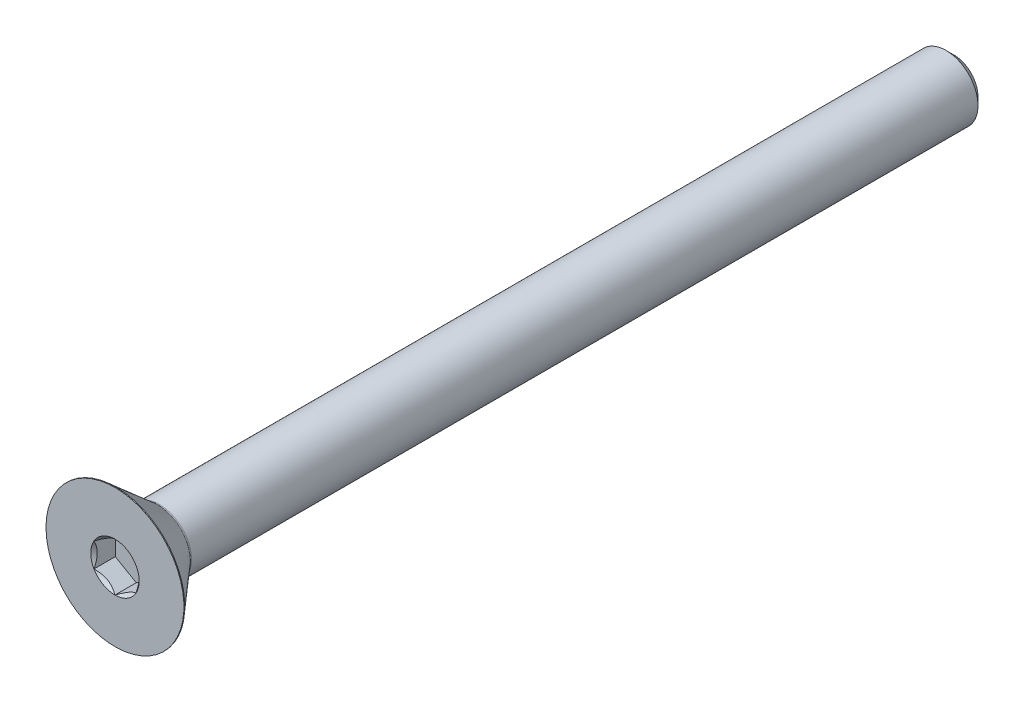
ISO-10303-21;
HEADER;
FILE_DESCRIPTION(('STEP AP214'),'2;1');
FILE_NAME('part.step','',(''),(''),'','','');
FILE_SCHEMA(('AUTOMOTIVE_DESIGN { 1 0 10303 214 1 1 1 1 }'));
ENDSEC;
DATA;
#1=APPLICATION_CONTEXT('core data for automotive mechanical design processes');
#2=APPLICATION_PROTOCOL_DEFINITION('international standard','automotive_design',2000,#1);
#3=PRODUCT_CONTEXT('',#1,'mechanical');
#4=PRODUCT('Part','Part','',(#3));
#5=PRODUCT_RELATED_PRODUCT_CATEGORY('part','',(#4));
#6=PRODUCT_DEFINITION_FORMATION('','',#4);
#7=PRODUCT_DEFINITION_CONTEXT('part definition',#1,'design');
#8=PRODUCT_DEFINITION('design','',#6,#7);
#9=PRODUCT_DEFINITION_SHAPE('','',#8);
#10=(LENGTH_UNIT() NAMED_UNIT(*) SI_UNIT(.MILLI.,.METRE.));
#11=(NAMED_UNIT(*) PLANE_ANGLE_UNIT() SI_UNIT($,.RADIAN.));
#12=(NAMED_UNIT(*) SI_UNIT($,.STERADIAN.) SOLID_ANGLE_UNIT());
#13=UNCERTAINTY_MEASURE_WITH_UNIT(LENGTH_MEASURE(1.E-05),#10,'distance_accuracy_value','');
#14=(GEOMETRIC_REPRESENTATION_CONTEXT(3) GLOBAL_UNCERTAINTY_ASSIGNED_CONTEXT((#13)) GLOBAL_UNIT_ASSIGNED_CONTEXT((#10,
#11,#12)) REPRESENTATION_CONTEXT('',''));
#15=CARTESIAN_POINT('',(0.,0.,0.));
#16=DIRECTION('',(0.,0.,1.));
#17=DIRECTION('',(1.,0.,0.));
#18=AXIS2_PLACEMENT_3D('',#15,#16,#17);
#19=CARTESIAN_POINT('',(0.,0.,31.75));
#20=DIRECTION('',(0.,0.,1.));
#21=DIRECTION('',(1.,0.,0.));
#22=AXIS2_PLACEMENT_3D('',#19,#20,#21);
#23=CONICAL_SURFACE('',#22,1.83308710467706,0.78539816339745);
#24=CARTESIAN_POINT('',(0.,0.,31.75));
#25=DIRECTION('',(0.,0.,1.));
#26=DIRECTION('',(1.,0.,0.));
#27=AXIS2_PLACEMENT_3D('',#24,#25,#26);
#28=CIRCLE('',#27,1.83308710467706);
#29=CARTESIAN_POINT('',(0.,-1.83308710467706,31.75));
#30=VERTEX_POINT('',#29);
#31=CARTESIAN_POINT('',(1.5875,-0.916543552338532,31.75));
#32=VERTEX_POINT('',#31);
#33=EDGE_CURVE('E235',#30,#32,#28,.T.);
#34=ORIENTED_EDGE('',*,*,#33,.T.);
#35=CARTESIAN_POINT('',(1.5877,-0.916428082284693,31.7501154809637));
#36=CARTESIAN_POINT('',(1.53312479190086,-0.947937093371809,31.7186308083706));
#37=CARTESIAN_POINT('',(1.47763696320971,-0.979973006203394,31.6889950460135));
#38=CARTESIAN_POINT('',(1.36449087915364,-1.04529792829092,31.6347322600208));
#39=CARTESIAN_POINT('',(1.30682185887062,-1.07859315267522,31.6101354351332));
#40=CARTESIAN_POINT('',(1.1905349781269,-1.14573141457583,31.5680003642726));
#41=CARTESIAN_POINT('',(1.13194674474407,-1.17955734689075,31.5503561927298));
#42=CARTESIAN_POINT('',(1.01348022674557,-1.24795402294714,31.523171470085));
#43=CARTESIAN_POINT('',(0.953605562983895,-1.28252267618759,31.5136106206951));
#44=CARTESIAN_POINT('',(0.850418771876558,-1.34209759781022,31.504984413104));
#45=CARTESIAN_POINT('',(0.807240015952288,-1.36702686416637,31.5037071928096));
#46=CARTESIAN_POINT('',(0.720953038535399,-1.41684467380557,31.5058570558147));
#47=CARTESIAN_POINT('',(0.677844847078612,-1.44173319974742,31.5092857885493));
#48=CARTESIAN_POINT('',(0.592046335002031,-1.49126899379091,31.5206509944333));
#49=CARTESIAN_POINT('',(0.549356408925406,-1.51591603410293,31.5285913718016));
#50=CARTESIAN_POINT('',(0.464693063478358,-1.56479643938728,31.5485484144511));
#51=CARTESIAN_POINT('',(0.422719959755075,-1.58902962212064,31.5605668292087));
#52=CARTESIAN_POINT('',(0.315211458113566,-1.65109968448354,31.5962468972473));
#53=CARTESIAN_POINT('',(0.250342771708898,-1.68855163804125,31.6225985723031));
#54=CARTESIAN_POINT('',(0.154961599380922,-1.74361998356043,31.6670835368517));
#55=CARTESIAN_POINT('',(0.123530699536156,-1.76176662204668,31.6827128578011));
#56=CARTESIAN_POINT('',(0.061246985569636,-1.79772614107138,31.7153984878611));
#57=CARTESIAN_POINT('',(0.0303939039605752,-1.8155391760437,31.732454115657));
#58=CARTESIAN_POINT('',(-0.000200000000001831,-1.8332025747309,31.7501154809637));
#59=B_SPLINE_CURVE_WITH_KNOTS('',3,(#35,#36,#37,#38,#39,#40,#41,#42,#43,#44,#45,#46,#47,#48,#49,
#50,#51,#52,#53,#54,#55,#56,#57,#58),.UNSPECIFIED.,.F.,.F.,(4,2,2,2,2,2,2,2,2,2,2,4),(0.,
0.211482650810816,0.424197870807277,0.633533884524818,0.842342653263349,0.991755553727142,
1.14122083674205,1.29081565918877,1.44047473906438,1.6781878086972,1.79671410024894,
1.91518409436631),.UNSPECIFIED.);
#60=EDGE_CURVE('E11',#32,#30,#59,.T.);
#61=ORIENTED_EDGE('',*,*,#60,.T.);
#62=EDGE_LOOP('',(#34,#61));
#63=FACE_BOUND('',#62,.T.);
#64=ADVANCED_FACE('F37',(#63),#23,.F.);
#65=CARTESIAN_POINT('',(-1.5875,-0.91654355233853,31.75));
#66=VERTEX_POINT('',#65);
#67=EDGE_CURVE('E240',#66,#30,#28,.T.);
#68=ORIENTED_EDGE('',*,*,#67,.T.);
#69=CARTESIAN_POINT('',(0.000200000000000431,-1.8332025747309,31.7501154809637));
#70=CARTESIAN_POINT('',(-0.0543752080991352,-1.80169356364378,31.7186308083706));
#71=CARTESIAN_POINT('',(-0.109863036790289,-1.7696576508122,31.6889950460135));
#72=CARTESIAN_POINT('',(-0.223009120846358,-1.70433272872468,31.6347322600208));
#73=CARTESIAN_POINT('',(-0.280678141129381,-1.67103750434037,31.6101354351332));
#74=CARTESIAN_POINT('',(-0.396965021873103,-1.60389924243976,31.5680003642726));
#75=CARTESIAN_POINT('',(-0.455553255255931,-1.57007331012484,31.5503561927298));
#76=CARTESIAN_POINT('',(-0.574019773254431,-1.50167663406845,31.523171470085));
#77=CARTESIAN_POINT('',(-0.633894437016105,-1.46710798082801,31.5136106206951));
#78=CARTESIAN_POINT('',(-0.737081228123442,-1.40753305920537,31.504984413104));
#79=CARTESIAN_POINT('',(-0.780259984047712,-1.38260379284922,31.5037071928096));
#80=CARTESIAN_POINT('',(-0.866546961464601,-1.33278598321002,31.5058570558147));
#81=CARTESIAN_POINT('',(-0.909655152921388,-1.30789745726817,31.5092857885493));
#82=CARTESIAN_POINT('',(-0.995453664997969,-1.25836166322468,31.5206509944333));
#83=CARTESIAN_POINT('',(-1.03814359107459,-1.23371462291266,31.5285913718016));
#84=CARTESIAN_POINT('',(-1.12280693652164,-1.18483421762831,31.5485484144511));
#85=CARTESIAN_POINT('',(-1.16478004024493,-1.16060103489495,31.5605668292087));
#86=CARTESIAN_POINT('',(-1.27228854188643,-1.09853097253205,31.5962468972473));
#87=CARTESIAN_POINT('',(-1.3371572282911,-1.06107901897434,31.6225985723031));
#88=CARTESIAN_POINT('',(-1.43253840061908,-1.00601067345516,31.6670835368517));
#89=CARTESIAN_POINT('',(-1.46396930046384,-0.987864034968913,31.6827128578011));
#90=CARTESIAN_POINT('',(-1.52625301443036,-0.951904515944213,31.7153984878611));
#91=CARTESIAN_POINT('',(-1.55710609603942,-0.934091480971892,31.732454115657));
#92=CARTESIAN_POINT('',(-1.5877,-0.916428082284692,31.7501154809637));
#93=B_SPLINE_CURVE_WITH_KNOTS('',3,(#69,#70,#71,#72,#73,#74,#75,#76,#77,#78,#79,#80,#81,#82,#83,
#84,#85,#86,#87,#88,#89,#90,#91,#92),.UNSPECIFIED.,.F.,.F.,(4,2,2,2,2,2,2,2,2,2,2,4),(0.,
0.211482650810816,0.424197870807277,0.633533884524818,0.842342653263349,0.991755553727142,
1.14122083674205,1.29081565918877,1.44047473906438,1.6781878086972,1.79671410024894,
1.91518409436632),.UNSPECIFIED.);
#94=EDGE_CURVE('E51',#30,#66,#93,.T.);
#95=ORIENTED_EDGE('',*,*,#94,.T.);
#96=EDGE_LOOP('',(#68,#95));
#97=FACE_BOUND('',#96,.T.);
#98=ADVANCED_FACE('F226',(#97),#23,.F.);
#99=CARTESIAN_POINT('',(-1.5875,0.916543552338532,31.75));
#100=VERTEX_POINT('',#99);
#101=EDGE_CURVE('E241',#100,#66,#28,.T.);
#102=ORIENTED_EDGE('',*,*,#101,.T.);
#103=CARTESIAN_POINT('',(-1.5875,-1.84970477544497,32.3544452553756));
#104=CARTESIAN_POINT('',(-1.5875,-1.80476240151239,32.3203462071708));
#105=CARTESIAN_POINT('',(-1.5875,-1.75957199117801,32.2865750198928));
#106=CARTESIAN_POINT('',(-1.5875,-1.66859358881314,32.2198243913548));
#107=CARTESIAN_POINT('',(-1.5875,-1.62280545181692,32.1868451478852));
#108=CARTESIAN_POINT('',(-1.5875,-1.48372199901346,32.0888287251651));
#109=CARTESIAN_POINT('',(-1.5875,-1.38939051274161,32.0252376365292));
#110=CARTESIAN_POINT('',(-1.5875,-1.1914395580246,31.9001998751445));
#111=CARTESIAN_POINT('',(-1.5875,-1.08759987522282,31.8390979424035));
#112=CARTESIAN_POINT('',(-1.5875,-0.874706489386582,31.7271896537273));
#113=CARTESIAN_POINT('',(-1.5875,-0.76567197590225,31.6763485632185));
#114=CARTESIAN_POINT('',(-1.5875,-0.602217292000081,31.6141427739001));
#115=CARTESIAN_POINT('',(-1.5875,-0.550263299202898,31.5963261951995));
#116=CARTESIAN_POINT('',(-1.5875,-0.445082037721642,31.5648615140692));
#117=CARTESIAN_POINT('',(-1.5875,-0.391854683409841,31.5512136928237));
#118=CARTESIAN_POINT('',(-1.5875,-0.285344657080772,31.5290290273729));
#119=CARTESIAN_POINT('',(-1.5875,-0.23208080021017,31.5204032745585));
#120=CARTESIAN_POINT('',(-1.5875,-0.124959456415258,31.5084346825164));
#121=CARTESIAN_POINT('',(-1.5875,-0.0711020784671781,31.5050908892227));
#122=CARTESIAN_POINT('',(-1.5875,0.0346213127870723,31.5039438271109));
#123=CARTESIAN_POINT('',(-1.5875,0.0864851538798602,31.5059346608082));
#124=CARTESIAN_POINT('',(-1.5875,0.189778917943214,31.5148876527514));
#125=CARTESIAN_POINT('',(-1.5875,0.241208798942214,31.5218502864056));
#126=CARTESIAN_POINT('',(-1.5875,0.344133383886249,31.5404812853777));
#127=CARTESIAN_POINT('',(-1.5875,0.395613227208262,31.5522304949867));
#128=CARTESIAN_POINT('',(-1.5875,0.49744523880822,31.5798036611326));
#129=CARTESIAN_POINT('',(-1.5875,0.547797493505242,31.5956273042326));
#130=CARTESIAN_POINT('',(-1.5875,0.705347074888852,31.6511176410875));
#131=CARTESIAN_POINT('',(-1.5875,0.810327219424591,31.6970631846965));
#132=CARTESIAN_POINT('',(-1.5875,1.01536433721947,31.7992446076069));
#133=CARTESIAN_POINT('',(-1.5875,1.1154020418522,31.8555172602774));
#134=CARTESIAN_POINT('',(-1.5875,1.30660224236785,31.9716420088267));
#135=CARTESIAN_POINT('',(-1.5875,1.39795887507227,32.0311784333227));
#136=CARTESIAN_POINT('',(-1.5875,1.53255412415746,32.1232282143955));
#137=CARTESIAN_POINT('',(-1.5875,1.57683885315435,32.1542385020961));
#138=CARTESIAN_POINT('',(-1.5875,1.66480239811795,32.2170825224737));
#139=CARTESIAN_POINT('',(-1.5875,1.70848137749646,32.2489160261633));
#140=CARTESIAN_POINT('',(-1.5875,1.75190803967257,32.2810909828344));
#141=B_SPLINE_CURVE_WITH_KNOTS('',3,(#103,#104,#105,#106,#107,#108,#109,#110,#111,#112,#113,
#114,#115,#116,#117,#118,#119,#120,#121,#122,#123,#124,#125,#126,#127,#128,#129,#130,#131,#132,
#133,#134,#135,#136,#137,#138,#139,#140),.UNSPECIFIED.,.F.,.F.,(4,2,2,2,2,2,2,2,2,2,2,2,2,2,2,2,
2,2,4),(0.,0.16923836493243,0.338518567064951,0.679661123808213,1.04081978780736,
1.40073457216113,1.56536778601317,1.73001210198752,1.89164527462954,2.05324924857509,
2.20870658565539,2.36417878970806,2.52239358424591,2.68059621131738,3.0233722729095,
3.36739346781147,3.69436280662922,3.85654464660761,4.0186818490024),.UNSPECIFIED.);
#142=EDGE_CURVE('E200',#66,#100,#141,.T.);
#143=ORIENTED_EDGE('',*,*,#142,.T.);
#144=EDGE_LOOP('',(#102,#143));
#145=FACE_BOUND('',#144,.T.);
#146=ADVANCED_FACE('F231',(#145),#23,.F.);
#147=CARTESIAN_POINT('',(0.,1.83308710467706,31.75));
#148=VERTEX_POINT('',#147);
#149=EDGE_CURVE('E144',#148,#100,#28,.T.);
#150=ORIENTED_EDGE('',*,*,#149,.T.);
#151=CARTESIAN_POINT('',(-1.5877,0.916428082284694,31.7501154809637));
#152=CARTESIAN_POINT('',(-1.53312479190087,0.947937093371809,31.7186308083706));
#153=CARTESIAN_POINT('',(-1.47763696320971,0.979973006203395,31.6889950460135));
#154=CARTESIAN_POINT('',(-1.36449087915364,1.04529792829092,31.6347322600208));
#155=CARTESIAN_POINT('',(-1.30682185887062,1.07859315267522,31.6101354351332));
#156=CARTESIAN_POINT('',(-1.1905349781269,1.14573141457583,31.5680003642726));
#157=CARTESIAN_POINT('',(-1.13194674474407,1.17955734689075,31.5503561927298));
#158=CARTESIAN_POINT('',(-1.01348022674557,1.24795402294714,31.523171470085));
#159=CARTESIAN_POINT('',(-0.953605562983896,1.28252267618759,31.5136106206951));
#160=CARTESIAN_POINT('',(-0.850418771876559,1.34209759781022,31.504984413104));
#161=CARTESIAN_POINT('',(-0.807240015952289,1.36702686416637,31.5037071928096));
#162=CARTESIAN_POINT('',(-0.7209530385354,1.41684467380557,31.5058570558147));
#163=CARTESIAN_POINT('',(-0.677844847078613,1.44173319974742,31.5092857885493));
#164=CARTESIAN_POINT('',(-0.592046335002032,1.49126899379091,31.5206509944333));
#165=CARTESIAN_POINT('',(-0.549356408925407,1.51591603410293,31.5285913718016));
#166=CARTESIAN_POINT('',(-0.46469306347836,1.56479643938728,31.5485484144511));
#167=CARTESIAN_POINT('',(-0.422719959755076,1.58902962212064,31.5605668292087));
#168=CARTESIAN_POINT('',(-0.315211458113566,1.65109968448354,31.5962468972473));
#169=CARTESIAN_POINT('',(-0.250342771708899,1.68855163804125,31.6225985723031));
#170=CARTESIAN_POINT('',(-0.154961599380923,1.74361998356043,31.6670835368517));
#171=CARTESIAN_POINT('',(-0.123530699536156,1.76176662204668,31.6827128578011));
#172=CARTESIAN_POINT('',(-0.0612469855696365,1.79772614107138,31.7153984878611));
#173=CARTESIAN_POINT('',(-0.0303939039605756,1.8155391760437,31.732454115657));
#174=CARTESIAN_POINT('',(0.000200000000001483,1.8332025747309,31.7501154809637));
#175=B_SPLINE_CURVE_WITH_KNOTS('',3,(#151,#152,#153,#154,#155,#156,#157,#158,#159,#160,#161,
#162,#163,#164,#165,#166,#167,#168,#169,#170,#171,#172,#173,#174),.UNSPECIFIED.,.F.,.F.,(4,2,2,
2,2,2,2,2,2,2,2,4),(0.,0.211482650810816,0.424197870807276,0.633533884524818,0.842342653263348,
0.991755553727142,1.14122083674205,1.29081565918877,1.44047473906438,1.6781878086972,
1.79671410024894,1.91518409436631),.UNSPECIFIED.);
#176=EDGE_CURVE('E108',#100,#148,#175,.T.);
#177=ORIENTED_EDGE('',*,*,#176,.T.);
#178=EDGE_LOOP('',(#150,#177));
#179=FACE_BOUND('',#178,.T.);
#180=ADVANCED_FACE('F254',(#179),#23,.F.);
#181=CARTESIAN_POINT('',(1.5875,0.916543552338531,31.75));
#182=VERTEX_POINT('',#181);
#183=EDGE_CURVE('E140',#182,#148,#28,.T.);
#184=ORIENTED_EDGE('',*,*,#183,.T.);
#185=CARTESIAN_POINT('',(-0.000200000000000509,1.8332025747309,31.7501154809637));
#186=CARTESIAN_POINT('',(0.054375208099135,1.80169356364378,31.7186308083706));
#187=CARTESIAN_POINT('',(0.109863036790288,1.7696576508122,31.6889950460135));
#188=CARTESIAN_POINT('',(0.223009120846358,1.70433272872468,31.6347322600208));
#189=CARTESIAN_POINT('',(0.280678141129381,1.67103750434037,31.6101354351332));
#190=CARTESIAN_POINT('',(0.396965021873103,1.60389924243976,31.5680003642726));
#191=CARTESIAN_POINT('',(0.455553255255931,1.57007331012484,31.5503561927298));
#192=CARTESIAN_POINT('',(0.574019773254431,1.50167663406845,31.523171470085));
#193=CARTESIAN_POINT('',(0.633894437016105,1.46710798082801,31.5136106206951));
#194=CARTESIAN_POINT('',(0.737081228123442,1.40753305920537,31.504984413104));
#195=CARTESIAN_POINT('',(0.780259984047712,1.38260379284922,31.5037071928096));
#196=CARTESIAN_POINT('',(0.866546961464601,1.33278598321002,31.5058570558147));
#197=CARTESIAN_POINT('',(0.909655152921388,1.30789745726817,31.5092857885493));
#198=CARTESIAN_POINT('',(0.995453664997969,1.25836166322469,31.5206509944333));
#199=CARTESIAN_POINT('',(1.03814359107459,1.23371462291266,31.5285913718016));
#200=CARTESIAN_POINT('',(1.12280693652164,1.18483421762831,31.5485484144511));
#201=CARTESIAN_POINT('',(1.16478004024493,1.16060103489495,31.5605668292087));
#202=CARTESIAN_POINT('',(1.27228854188643,1.09853097253205,31.5962468972473));
#203=CARTESIAN_POINT('',(1.3371572282911,1.06107901897434,31.6225985723031));
#204=CARTESIAN_POINT('',(1.43253840061908,1.00601067345516,31.6670835368517));
#205=CARTESIAN_POINT('',(1.46396930046384,0.987864034968914,31.6827128578011));
#206=CARTESIAN_POINT('',(1.52625301443036,0.951904515944214,31.7153984878611));
#207=CARTESIAN_POINT('',(1.55710609603942,0.934091480971893,31.732454115657));
#208=CARTESIAN_POINT('',(1.5877,0.916428082284692,31.7501154809637));
#209=B_SPLINE_CURVE_WITH_KNOTS('',3,(#185,#186,#187,#188,#189,#190,#191,#192,#193,#194,#195,
#196,#197,#198,#199,#200,#201,#202,#203,#204,#205,#206,#207,#208),.UNSPECIFIED.,.F.,.F.,(4,2,2,
2,2,2,2,2,2,2,2,4),(0.,0.211482650810816,0.424197870807277,0.633533884524818,0.842342653263349,
0.991755553727143,1.14122083674205,1.29081565918877,1.44047473906438,1.6781878086972,
1.79671410024894,1.91518409436631),.UNSPECIFIED.);
#210=EDGE_CURVE('E170',#148,#182,#209,.T.);
#211=ORIENTED_EDGE('',*,*,#210,.T.);
#212=EDGE_LOOP('',(#184,#211));
#213=FACE_BOUND('',#212,.T.);
#214=ADVANCED_FACE('F187',(#213),#23,.F.);
#215=CARTESIAN_POINT('',(0.,0.,-31.75));
#216=DIRECTION('',(0.,0.,-1.));
#217=DIRECTION('',(-1.,0.,0.));
#218=AXIS2_PLACEMENT_3D('',#215,#216,#217);
#219=CYLINDRICAL_SURFACE('',#218,5.2197);
#220=CARTESIAN_POINT('',(0.,0.,31.75));
#221=DIRECTION('',(0.,0.,-1.));
#222=DIRECTION('',(-1.,0.,0.));
#223=AXIS2_PLACEMENT_3D('',#220,#221,#222);
#224=CIRCLE('',#223,5.2197);
#225=CARTESIAN_POINT('',(-5.2197,0.,31.75));
#226=VERTEX_POINT('',#225);
#227=EDGE_CURVE('E159',#226,#226,#224,.T.);
#228=ORIENTED_EDGE('',*,*,#227,.T.);
#229=EDGE_LOOP('',(#228));
#230=FACE_BOUND('',#229,.T.);
#231=CARTESIAN_POINT('',(0.,0.,31.685484));
#232=DIRECTION('',(0.,0.,-1.));
#233=DIRECTION('',(-1.,0.,0.));
#234=AXIS2_PLACEMENT_3D('',#231,#232,#233);
#235=CIRCLE('',#234,5.2197);
#236=CARTESIAN_POINT('',(-5.2197,0.,31.685484));
#237=VERTEX_POINT('',#236);
#238=EDGE_CURVE('E143',#237,#237,#235,.T.);
#239=ORIENTED_EDGE('',*,*,#238,.F.);
#240=EDGE_LOOP('',(#239));
#241=FACE_BOUND('',#240,.T.);
#242=ADVANCED_FACE('F39',(#230,#241),#219,.T.);
#243=CARTESIAN_POINT('',(0.,0.,31.75));
#244=DIRECTION('',(0.,0.,1.));
#245=DIRECTION('',(1.,0.,0.));
#246=AXIS2_PLACEMENT_3D('',#243,#244,#245);
#247=PLANE('',#246);
#248=ORIENTED_EDGE('',*,*,#183,.F.);
#249=EDGE_CURVE('E133',#32,#182,#28,.T.);
#250=ORIENTED_EDGE('',*,*,#249,.F.);
#251=ORIENTED_EDGE('',*,*,#33,.F.);
#252=ORIENTED_EDGE('',*,*,#67,.F.);
#253=ORIENTED_EDGE('',*,*,#101,.F.);
#254=ORIENTED_EDGE('',*,*,#149,.F.);
#255=EDGE_LOOP('',(#248,#250,#251,#252,#253,#254));
#256=FACE_BOUND('',#255,.T.);
#257=ORIENTED_EDGE('',*,*,#227,.F.);
#258=EDGE_LOOP('',(#257));
#259=FACE_BOUND('',#258,.T.);
#260=ADVANCED_FACE('F245',(#256,#259),#247,.T.);
#261=CARTESIAN_POINT('',(0.,1.81768750000001,-31.75));
#262=DIRECTION('',(0.,0.,-1.));
#263=DIRECTION('',(-1.,0.,0.));
#264=AXIS2_PLACEMENT_3D('',#261,#262,#263);
#265=PLANE('',#264);
#266=CARTESIAN_POINT('',(0.,0.,-31.75));
#267=DIRECTION('',(0.,0.,-1.));
#268=DIRECTION('',(-1.,0.,0.));
#269=AXIS2_PLACEMENT_3D('',#266,#267,#268);
#270=CIRCLE('',#269,1.81768750000001);
#271=CARTESIAN_POINT('',(-1.81768750000001,0.,-31.75));
#272=VERTEX_POINT('',#271);
#273=EDGE_CURVE('E156',#272,#272,#270,.T.);
#274=ORIENTED_EDGE('',*,*,#273,.T.);
#275=EDGE_LOOP('',(#274));
#276=FACE_BOUND('',#275,.T.);
#277=ADVANCED_FACE('F310',(#276),#265,.T.);
#278=CARTESIAN_POINT('',(0.,0.,-31.75));
#279=DIRECTION('',(0.,0.,1.));
#280=DIRECTION('',(1.,0.,0.));
#281=AXIS2_PLACEMENT_3D('',#278,#279,#280);
#282=CONICAL_SURFACE('',#281,1.81768750000001,0.785398163397453);
#283=CARTESIAN_POINT('',(0.,0.,-31.1546875));
#284=DIRECTION('',(0.,0.,-1.));
#285=DIRECTION('',(-1.,0.,0.));
#286=AXIS2_PLACEMENT_3D('',#283,#284,#285);
#287=CIRCLE('',#286,2.41300000000002);
#288=CARTESIAN_POINT('',(-2.41300000000002,0.,-31.1546875));
#289=VERTEX_POINT('',#288);
#290=EDGE_CURVE('E153',#289,#289,#287,.T.);
#291=ORIENTED_EDGE('',*,*,#290,.T.);
#292=EDGE_LOOP('',(#291));
#293=FACE_BOUND('',#292,.T.);
#294=ORIENTED_EDGE('',*,*,#273,.F.);
#295=EDGE_LOOP('',(#294));
#296=FACE_BOUND('',#295,.T.);
#297=ADVANCED_FACE('F300',(#293,#296),#282,.T.);
#298=CARTESIAN_POINT('',(0.,0.,-31.75));
#299=DIRECTION('',(0.,0.,-1.));
#300=DIRECTION('',(-1.,0.,0.));
#301=AXIS2_PLACEMENT_3D('',#298,#299,#300);
#302=CYLINDRICAL_SURFACE('',#301,2.41300000000001);
#303=CARTESIAN_POINT('',(0.,0.,28.3673662286613));
#304=DIRECTION('',(0.,0.,-1.));
#305=DIRECTION('',(-1.,0.,0.));
#306=AXIS2_PLACEMENT_3D('',#303,#304,#305);
#307=CIRCLE('',#306,2.413);
#308=CARTESIAN_POINT('',(-2.413,0.,28.3673662286613));
#309=VERTEX_POINT('',#308);
#310=EDGE_CURVE('E150',#309,#309,#307,.T.);
#311=ORIENTED_EDGE('',*,*,#310,.T.);
#312=EDGE_LOOP('',(#311));
#313=FACE_BOUND('',#312,.T.);
#314=ORIENTED_EDGE('',*,*,#290,.F.);
#315=EDGE_LOOP('',(#314));
#316=FACE_BOUND('',#315,.T.);
#317=ADVANCED_FACE('F291',(#313,#316),#302,.T.);
#318=CARTESIAN_POINT('',(0.,0.,28.3673662286613));
#319=DIRECTION('',(0.,0.,-1.));
#320=DIRECTION('',(-1.,0.,0.));
#321=AXIS2_PLACEMENT_3D('',#318,#319,#320);
#322=TOROIDAL_SURFACE('',#321,2.65205436006274,0.239054360062738);
#323=CARTESIAN_POINT('',(0.,0.,28.5242));
#324=DIRECTION('',(0.,0.,-1.));
#325=DIRECTION('',(-1.,0.,0.));
#326=AXIS2_PLACEMENT_3D('',#323,#324,#325);
#327=CIRCLE('',#326,2.47163774432937);
#328=CARTESIAN_POINT('',(-2.47163774432937,0.,28.5242));
#329=VERTEX_POINT('',#328);
#330=EDGE_CURVE('E147',#329,#329,#327,.T.);
#331=ORIENTED_EDGE('',*,*,#330,.T.);
#332=EDGE_LOOP('',(#331));
#333=FACE_BOUND('',#332,.T.);
#334=ORIENTED_EDGE('',*,*,#310,.F.);
#335=EDGE_LOOP('',(#334));
#336=FACE_BOUND('',#335,.T.);
#337=ADVANCED_FACE('F281',(#333,#336),#322,.F.);
#338=CARTESIAN_POINT('',(0.,0.,28.5242));
#339=DIRECTION('',(0.,0.,1.));
#340=DIRECTION('',(1.,0.,0.));
#341=AXIS2_PLACEMENT_3D('',#338,#339,#340);
#342=CONICAL_SURFACE('',#341,2.47163774432937,0.715584993317676);
#343=ORIENTED_EDGE('',*,*,#238,.T.);
#344=EDGE_LOOP('',(#343));
#345=FACE_BOUND('',#344,.T.);
#346=ORIENTED_EDGE('',*,*,#330,.F.);
#347=EDGE_LOOP('',(#346));
#348=FACE_BOUND('',#347,.T.);
#349=ADVANCED_FACE('F185',(#345,#348),#342,.T.);
#350=ORIENTED_EDGE('',*,*,#249,.T.);
#351=CARTESIAN_POINT('',(1.5875,-1.84970477544497,32.3544452553756));
#352=CARTESIAN_POINT('',(1.5875,-1.8047624015124,32.3203462071708));
#353=CARTESIAN_POINT('',(1.5875,-1.75957199117802,32.2865750198928));
#354=CARTESIAN_POINT('',(1.5875,-1.66859358881315,32.2198243913548));
#355=CARTESIAN_POINT('',(1.5875,-1.62280545181693,32.1868451478852));
#356=CARTESIAN_POINT('',(1.5875,-1.48372199901346,32.0888287251651));
#357=CARTESIAN_POINT('',(1.5875,-1.38939051274161,32.0252376365292));
#358=CARTESIAN_POINT('',(1.5875,-1.1914395580246,31.9001998751445));
#359=CARTESIAN_POINT('',(1.5875,-1.08759987522282,31.8390979424035));
#360=CARTESIAN_POINT('',(1.5875,-0.874706489386582,31.7271896537273));
#361=CARTESIAN_POINT('',(1.5875,-0.765671975902249,31.6763485632185));
#362=CARTESIAN_POINT('',(1.5875,-0.60221729200008,31.6141427739001));
#363=CARTESIAN_POINT('',(1.5875,-0.550263299202897,31.5963261951995));
#364=CARTESIAN_POINT('',(1.5875,-0.445082037721641,31.5648615140692));
#365=CARTESIAN_POINT('',(1.5875,-0.391854683409841,31.5512136928237));
#366=CARTESIAN_POINT('',(1.5875,-0.285344657080771,31.5290290273729));
#367=CARTESIAN_POINT('',(1.5875,-0.232080800210169,31.5204032745585));
#368=CARTESIAN_POINT('',(1.5875,-0.124959456415258,31.5084346825164));
#369=CARTESIAN_POINT('',(1.5875,-0.0711020784671783,31.5050908892227));
#370=CARTESIAN_POINT('',(1.5875,0.034621312787072,31.5039438271109));
#371=CARTESIAN_POINT('',(1.5875,0.0864851538798599,31.5059346608082));
#372=CARTESIAN_POINT('',(1.5875,0.189778917943214,31.5148876527514));
#373=CARTESIAN_POINT('',(1.5875,0.241208798942214,31.5218502864056));
#374=CARTESIAN_POINT('',(1.5875,0.344133383886249,31.5404812853777));
#375=CARTESIAN_POINT('',(1.5875,0.395613227208262,31.5522304949867));
#376=CARTESIAN_POINT('',(1.5875,0.49744523880822,31.5798036611326));
#377=CARTESIAN_POINT('',(1.5875,0.547797493505242,31.5956273042326));
#378=CARTESIAN_POINT('',(1.5875,0.70534707488885,31.6511176410875));
#379=CARTESIAN_POINT('',(1.5875,0.810327219424589,31.6970631846965));
#380=CARTESIAN_POINT('',(1.5875,1.01536433721947,31.7992446076069));
#381=CARTESIAN_POINT('',(1.5875,1.1154020418522,31.8555172602773));
#382=CARTESIAN_POINT('',(1.5875,1.30660224236784,31.9716420088267));
#383=CARTESIAN_POINT('',(1.5875,1.39795887507227,32.0311784333227));
#384=CARTESIAN_POINT('',(1.5875,1.53255412415746,32.1232282143955));
#385=CARTESIAN_POINT('',(1.5875,1.57683885315434,32.1542385020961));
#386=CARTESIAN_POINT('',(1.5875,1.66480239811794,32.2170825224737));
#387=CARTESIAN_POINT('',(1.5875,1.70848137749645,32.2489160261633));
#388=CARTESIAN_POINT('',(1.5875,1.75190803967257,32.2810909828344));
#389=B_SPLINE_CURVE_WITH_KNOTS('',3,(#351,#352,#353,#354,#355,#356,#357,#358,#359,#360,#361,
#362,#363,#364,#365,#366,#367,#368,#369,#370,#371,#372,#373,#374,#375,#376,#377,#378,#379,#380,
#381,#382,#383,#384,#385,#386,#387,#388),.UNSPECIFIED.,.F.,.F.,(4,2,2,2,2,2,2,2,2,2,2,2,2,2,2,2,
2,2,4),(0.,0.169238364932428,0.338518567064949,0.679661123808217,1.04081978780736,
1.40073457216113,1.56536778601318,1.73001210198753,1.89164527462955,2.0532492485751,
2.2087065856554,2.36417878970806,2.52239358424591,2.68059621131738,3.02337227290949,
3.36739346781147,3.69436280662922,3.85654464660761,4.01868184900241),.UNSPECIFIED.);
#390=EDGE_CURVE('E162',#182,#32,#389,.F.);
#391=ORIENTED_EDGE('',*,*,#390,.T.);
#392=EDGE_LOOP('',(#350,#391));
#393=FACE_BOUND('',#392,.T.);
#394=ADVANCED_FACE('F179',(#393),#23,.F.);
#395=CARTESIAN_POINT('',(0.,-1.83308710467706,30.1371));
#396=DIRECTION('',(0.5,-0.866025403784439,0.));
#397=DIRECTION('',(0.866025403784439,0.5,0.));
#398=AXIS2_PLACEMENT_3D('',#395,#396,#397);
#399=PLANE('',#398);
#400=DIRECTION('',(0.,0.,1.));
#401=VECTOR('',#400,1.);
#402=CARTESIAN_POINT('',(1.5875,-0.916543552338531,30.1371));
#403=LINE('',#402,#401);
#404=CARTESIAN_POINT('',(1.5875,-0.916543552338531,30.1371));
#405=VERTEX_POINT('',#404);
#406=EDGE_CURVE('E58',#405,#32,#403,.T.);
#407=ORIENTED_EDGE('',*,*,#406,.F.);
#408=DIRECTION('',(0.866025403784439,0.5,0.));
#409=VECTOR('',#408,1.);
#410=CARTESIAN_POINT('',(0.,-1.83308710467706,30.1371));
#411=LINE('',#410,#409);
#412=CARTESIAN_POINT('',(0.,-1.83308710467706,30.1371));
#413=VERTEX_POINT('',#412);
#414=EDGE_CURVE('E418',#413,#405,#411,.T.);
#415=ORIENTED_EDGE('',*,*,#414,.F.);
#416=DIRECTION('',(0.,0.,1.));
#417=VECTOR('',#416,1.);
#418=CARTESIAN_POINT('',(0.,-1.83308710467706,30.1371));
#419=LINE('',#418,#417);
#420=EDGE_CURVE('E67',#413,#30,#419,.T.);
#421=ORIENTED_EDGE('',*,*,#420,.T.);
#422=ORIENTED_EDGE('',*,*,#60,.F.);
#423=EDGE_LOOP('',(#407,#415,#421,#422));
#424=FACE_BOUND('',#423,.T.);
#425=ADVANCED_FACE('F184',(#424),#399,.F.);
#426=CARTESIAN_POINT('',(-1.5875,-0.91654355233853,30.1371));
#427=DIRECTION('',(-0.5,-0.866025403784439,0.));
#428=DIRECTION('',(0.866025403784439,-0.5,0.));
#429=AXIS2_PLACEMENT_3D('',#426,#427,#428);
#430=PLANE('',#429);
#431=ORIENTED_EDGE('',*,*,#420,.F.);
#432=DIRECTION('',(0.866025403784438,-0.5,0.));
#433=VECTOR('',#432,1.);
#434=CARTESIAN_POINT('',(-1.5875,-0.91654355233853,30.1371));
#435=LINE('',#434,#433);
#436=CARTESIAN_POINT('',(-1.5875,-0.91654355233853,30.1371));
#437=VERTEX_POINT('',#436);
#438=EDGE_CURVE('E119',#437,#413,#435,.T.);
#439=ORIENTED_EDGE('',*,*,#438,.F.);
#440=DIRECTION('',(0.,0.,1.));
#441=VECTOR('',#440,1.);
#442=CARTESIAN_POINT('',(-1.5875,-0.91654355233853,30.1371));
#443=LINE('',#442,#441);
#444=EDGE_CURVE('E111',#437,#66,#443,.T.);
#445=ORIENTED_EDGE('',*,*,#444,.T.);
#446=ORIENTED_EDGE('',*,*,#94,.F.);
#447=EDGE_LOOP('',(#431,#439,#445,#446));
#448=FACE_BOUND('',#447,.T.);
#449=ADVANCED_FACE('F211',(#448),#430,.F.);
#450=CARTESIAN_POINT('',(-1.5875,0.916543552338532,30.1371));
#451=DIRECTION('',(-1.,0.,0.));
#452=DIRECTION('',(0.,0.,1.));
#453=AXIS2_PLACEMENT_3D('',#450,#451,#452);
#454=PLANE('',#453);
#455=ORIENTED_EDGE('',*,*,#444,.F.);
#456=DIRECTION('',(0.,-1.,0.));
#457=VECTOR('',#456,1.);
#458=CARTESIAN_POINT('',(-1.5875,0.916543552338532,30.1371));
#459=LINE('',#458,#457);
#460=CARTESIAN_POINT('',(-1.5875,0.916543552338532,30.1371));
#461=VERTEX_POINT('',#460);
#462=EDGE_CURVE('E115',#461,#437,#459,.T.);
#463=ORIENTED_EDGE('',*,*,#462,.F.);
#464=DIRECTION('',(0.,0.,1.));
#465=VECTOR('',#464,1.);
#466=CARTESIAN_POINT('',(-1.5875,0.916543552338532,30.1371));
#467=LINE('',#466,#465);
#468=EDGE_CURVE('E100',#461,#100,#467,.T.);
#469=ORIENTED_EDGE('',*,*,#468,.T.);
#470=ORIENTED_EDGE('',*,*,#142,.F.);
#471=EDGE_LOOP('',(#455,#463,#469,#470));
#472=FACE_BOUND('',#471,.T.);
#473=ADVANCED_FACE('F116',(#472),#454,.F.);
#474=CARTESIAN_POINT('',(0.,1.83308710467706,30.1371));
#475=DIRECTION('',(-0.5,0.866025403784439,0.));
#476=DIRECTION('',(-0.866025403784439,-0.5,0.));
#477=AXIS2_PLACEMENT_3D('',#474,#475,#476);
#478=PLANE('',#477);
#479=ORIENTED_EDGE('',*,*,#468,.F.);
#480=DIRECTION('',(-0.866025403784439,-0.5,0.));
#481=VECTOR('',#480,1.);
#482=CARTESIAN_POINT('',(0.,1.83308710467706,30.1371));
#483=LINE('',#482,#481);
#484=CARTESIAN_POINT('',(0.,1.83308710467706,30.1371));
#485=VERTEX_POINT('',#484);
#486=EDGE_CURVE('E105',#485,#461,#483,.T.);
#487=ORIENTED_EDGE('',*,*,#486,.F.);
#488=DIRECTION('',(0.,0.,1.));
#489=VECTOR('',#488,1.);
#490=CARTESIAN_POINT('',(0.,1.83308710467706,30.1371));
#491=LINE('',#490,#489);
#492=EDGE_CURVE('E112',#485,#148,#491,.T.);
#493=ORIENTED_EDGE('',*,*,#492,.T.);
#494=ORIENTED_EDGE('',*,*,#176,.F.);
#495=EDGE_LOOP('',(#479,#487,#493,#494));
#496=FACE_BOUND('',#495,.T.);
#497=ADVANCED_FACE('F102',(#496),#478,.F.);
#498=CARTESIAN_POINT('',(1.5875,0.916543552338531,30.1371));
#499=DIRECTION('',(0.5,0.866025403784439,0.));
#500=DIRECTION('',(-0.866025403784439,0.5,0.));
#501=AXIS2_PLACEMENT_3D('',#498,#499,#500);
#502=PLANE('',#501);
#503=ORIENTED_EDGE('',*,*,#492,.F.);
#504=DIRECTION('',(-0.866025403784438,0.5,0.));
#505=VECTOR('',#504,1.);
#506=CARTESIAN_POINT('',(1.5875,0.916543552338531,30.1371));
#507=LINE('',#506,#505);
#508=CARTESIAN_POINT('',(1.5875,0.916543552338531,30.1371));
#509=VERTEX_POINT('',#508);
#510=EDGE_CURVE('E125',#509,#485,#507,.T.);
#511=ORIENTED_EDGE('',*,*,#510,.F.);
#512=DIRECTION('',(0.,0.,1.));
#513=VECTOR('',#512,1.);
#514=CARTESIAN_POINT('',(1.5875,0.916543552338531,30.1371));
#515=LINE('',#514,#513);
#516=EDGE_CURVE('E136',#509,#182,#515,.T.);
#517=ORIENTED_EDGE('',*,*,#516,.T.);
#518=ORIENTED_EDGE('',*,*,#210,.F.);
#519=EDGE_LOOP('',(#503,#511,#517,#518));
#520=FACE_BOUND('',#519,.T.);
#521=ADVANCED_FACE('F218',(#520),#502,.F.);
#522=CARTESIAN_POINT('',(1.5875,-0.916543552338531,30.1371));
#523=DIRECTION('',(1.,0.,0.));
#524=DIRECTION('',(0.,1.,0.));
#525=AXIS2_PLACEMENT_3D('',#522,#523,#524);
#526=PLANE('',#525);
#527=ORIENTED_EDGE('',*,*,#516,.F.);
#528=DIRECTION('',(0.,1.,0.));
#529=VECTOR('',#528,1.);
#530=CARTESIAN_POINT('',(1.5875,-0.916543552338531,30.1371));
#531=LINE('',#530,#529);
#532=EDGE_CURVE('E127',#405,#509,#531,.T.);
#533=ORIENTED_EDGE('',*,*,#532,.F.);
#534=ORIENTED_EDGE('',*,*,#406,.T.);
#535=ORIENTED_EDGE('',*,*,#390,.F.);
#536=EDGE_LOOP('',(#527,#533,#534,#535));
#537=FACE_BOUND('',#536,.T.);
#538=ADVANCED_FACE('F177',(#537),#526,.F.);
#539=CARTESIAN_POINT('',(0.,0.,30.1371));
#540=DIRECTION('',(0.,0.,1.));
#541=DIRECTION('',(1.,0.,0.));
#542=AXIS2_PLACEMENT_3D('',#539,#540,#541);
#543=PLANE('',#542);
#544=ORIENTED_EDGE('',*,*,#414,.T.);
#545=ORIENTED_EDGE('',*,*,#532,.T.);
#546=ORIENTED_EDGE('',*,*,#510,.T.);
#547=ORIENTED_EDGE('',*,*,#486,.T.);
#548=ORIENTED_EDGE('',*,*,#462,.T.);
#549=ORIENTED_EDGE('',*,*,#438,.T.);
#550=EDGE_LOOP('',(#544,#545,#546,#547,#548,#549));
#551=FACE_BOUND('',#550,.T.);
#552=ADVANCED_FACE('F122',(#551),#543,.T.);
#553=CLOSED_SHELL('',(#64,#98,#146,#180,#214,#242,#260,#277,#297,#317,#337,#349,#394,#425,#449,
#473,#497,#521,#538,#552));
#554=MANIFOLD_SOLID_BREP('B2',#553);
#555=ADVANCED_BREP_SHAPE_REPRESENTATION('',(#18,#554),#14);
#556=SHAPE_DEFINITION_REPRESENTATION(#9,#555);
ENDSEC;
END-ISO-10303-21;
